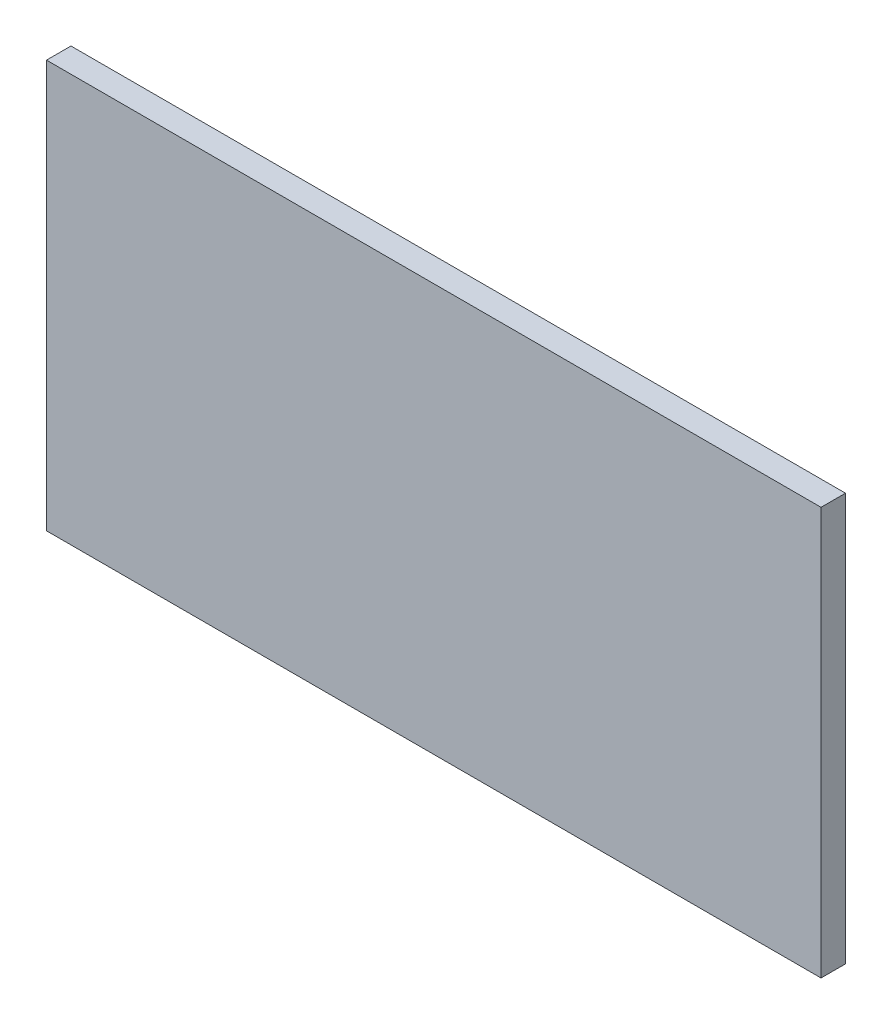
ISO-10303-21;
HEADER;
FILE_DESCRIPTION(('STEP AP214'),'2;1');
FILE_NAME('part.step','',(''),(''),'','','');
FILE_SCHEMA(('AUTOMOTIVE_DESIGN { 1 0 10303 214 1 1 1 1 }'));
ENDSEC;
DATA;
#1=APPLICATION_CONTEXT('core data for automotive mechanical design processes');
#2=APPLICATION_PROTOCOL_DEFINITION('international standard','automotive_design',2000,#1);
#3=PRODUCT_CONTEXT('',#1,'mechanical');
#4=PRODUCT('Part','Part','',(#3));
#5=PRODUCT_RELATED_PRODUCT_CATEGORY('part','',(#4));
#6=PRODUCT_DEFINITION_FORMATION('','',#4);
#7=PRODUCT_DEFINITION_CONTEXT('part definition',#1,'design');
#8=PRODUCT_DEFINITION('design','',#6,#7);
#9=PRODUCT_DEFINITION_SHAPE('','',#8);
#10=(LENGTH_UNIT() NAMED_UNIT(*) SI_UNIT(.MILLI.,.METRE.));
#11=(NAMED_UNIT(*) PLANE_ANGLE_UNIT() SI_UNIT($,.RADIAN.));
#12=(NAMED_UNIT(*) SI_UNIT($,.STERADIAN.) SOLID_ANGLE_UNIT());
#13=UNCERTAINTY_MEASURE_WITH_UNIT(LENGTH_MEASURE(1.E-05),#10,'distance_accuracy_value','');
#14=(GEOMETRIC_REPRESENTATION_CONTEXT(3) GLOBAL_UNCERTAINTY_ASSIGNED_CONTEXT((#13)) GLOBAL_UNIT_ASSIGNED_CONTEXT((#10,
#11,#12)) REPRESENTATION_CONTEXT('',''));
#15=CARTESIAN_POINT('',(0.,0.,0.));
#16=DIRECTION('',(0.,0.,1.));
#17=DIRECTION('',(1.,0.,0.));
#18=AXIS2_PLACEMENT_3D('',#15,#16,#17);
#19=CARTESIAN_POINT('',(0.,0.,12.));
#20=DIRECTION('',(1.,0.,0.));
#21=DIRECTION('',(0.,0.,-1.));
#22=AXIS2_PLACEMENT_3D('',#19,#20,#21);
#23=PLANE('',#22);
#24=DIRECTION('',(0.,-1.,0.));
#25=VECTOR('',#24,1.);
#26=CARTESIAN_POINT('',(0.,0.,0.));
#27=LINE('',#26,#25);
#28=CARTESIAN_POINT('',(0.,200.,0.));
#29=VERTEX_POINT('',#28);
#30=CARTESIAN_POINT('',(0.,0.,0.));
#31=VERTEX_POINT('',#30);
#32=EDGE_CURVE('E93',#29,#31,#27,.T.);
#33=ORIENTED_EDGE('',*,*,#32,.T.);
#34=DIRECTION('',(0.,0.,-1.));
#35=VECTOR('',#34,1.);
#36=CARTESIAN_POINT('',(0.,0.,12.));
#37=LINE('',#36,#35);
#38=CARTESIAN_POINT('',(0.,0.,12.));
#39=VERTEX_POINT('',#38);
#40=EDGE_CURVE('E11',#39,#31,#37,.T.);
#41=ORIENTED_EDGE('',*,*,#40,.F.);
#42=DIRECTION('',(0.,-1.,0.));
#43=VECTOR('',#42,1.);
#44=CARTESIAN_POINT('',(0.,0.,12.));
#45=LINE('',#44,#43);
#46=CARTESIAN_POINT('',(0.,200.,12.));
#47=VERTEX_POINT('',#46);
#48=EDGE_CURVE('E81',#47,#39,#45,.T.);
#49=ORIENTED_EDGE('',*,*,#48,.F.);
#50=DIRECTION('',(0.,0.,-1.));
#51=VECTOR('',#50,1.);
#52=CARTESIAN_POINT('',(0.,200.,12.));
#53=LINE('',#52,#51);
#54=EDGE_CURVE('E89',#47,#29,#53,.T.);
#55=ORIENTED_EDGE('',*,*,#54,.T.);
#56=EDGE_LOOP('',(#33,#41,#49,#55));
#57=FACE_BOUND('',#56,.T.);
#58=ADVANCED_FACE('F30',(#57),#23,.F.);
#59=CARTESIAN_POINT('',(0.,0.,12.));
#60=DIRECTION('',(0.,1.,0.));
#61=DIRECTION('',(0.,0.,1.));
#62=AXIS2_PLACEMENT_3D('',#59,#60,#61);
#63=PLANE('',#62);
#64=DIRECTION('',(1.,0.,0.));
#65=VECTOR('',#64,1.);
#66=CARTESIAN_POINT('',(0.,0.,0.));
#67=LINE('',#66,#65);
#68=CARTESIAN_POINT('',(380.,0.,0.));
#69=VERTEX_POINT('',#68);
#70=EDGE_CURVE('E85',#31,#69,#67,.T.);
#71=ORIENTED_EDGE('',*,*,#70,.T.);
#72=DIRECTION('',(0.,0.,-1.));
#73=VECTOR('',#72,1.);
#74=CARTESIAN_POINT('',(380.,0.,12.));
#75=LINE('',#74,#73);
#76=CARTESIAN_POINT('',(380.,0.,12.));
#77=VERTEX_POINT('',#76);
#78=EDGE_CURVE('E38',#77,#69,#75,.T.);
#79=ORIENTED_EDGE('',*,*,#78,.F.);
#80=DIRECTION('',(1.,0.,0.));
#81=VECTOR('',#80,1.);
#82=CARTESIAN_POINT('',(0.,0.,12.));
#83=LINE('',#82,#81);
#84=EDGE_CURVE('E76',#39,#77,#83,.T.);
#85=ORIENTED_EDGE('',*,*,#84,.F.);
#86=ORIENTED_EDGE('',*,*,#40,.T.);
#87=EDGE_LOOP('',(#71,#79,#85,#86));
#88=FACE_BOUND('',#87,.T.);
#89=ADVANCED_FACE('F84',(#88),#63,.F.);
#90=CARTESIAN_POINT('',(380.,0.,12.));
#91=DIRECTION('',(-1.,0.,0.));
#92=DIRECTION('',(0.,0.,1.));
#93=AXIS2_PLACEMENT_3D('',#90,#91,#92);
#94=PLANE('',#93);
#95=DIRECTION('',(0.,1.,0.));
#96=VECTOR('',#95,1.);
#97=CARTESIAN_POINT('',(380.,0.,0.));
#98=LINE('',#97,#96);
#99=CARTESIAN_POINT('',(380.,200.,0.));
#100=VERTEX_POINT('',#99);
#101=EDGE_CURVE('E63',#69,#100,#98,.T.);
#102=ORIENTED_EDGE('',*,*,#101,.T.);
#103=DIRECTION('',(0.,0.,-1.));
#104=VECTOR('',#103,1.);
#105=CARTESIAN_POINT('',(380.,200.,12.));
#106=LINE('',#105,#104);
#107=CARTESIAN_POINT('',(380.,200.,12.));
#108=VERTEX_POINT('',#107);
#109=EDGE_CURVE('E86',#108,#100,#106,.T.);
#110=ORIENTED_EDGE('',*,*,#109,.F.);
#111=DIRECTION('',(0.,1.,0.));
#112=VECTOR('',#111,1.);
#113=CARTESIAN_POINT('',(380.,0.,12.));
#114=LINE('',#113,#112);
#115=EDGE_CURVE('E79',#77,#108,#114,.T.);
#116=ORIENTED_EDGE('',*,*,#115,.F.);
#117=ORIENTED_EDGE('',*,*,#78,.T.);
#118=EDGE_LOOP('',(#102,#110,#116,#117));
#119=FACE_BOUND('',#118,.T.);
#120=ADVANCED_FACE('F87',(#119),#94,.F.);
#121=CARTESIAN_POINT('',(0.,200.,12.));
#122=DIRECTION('',(0.,-1.,0.));
#123=DIRECTION('',(0.,0.,-1.));
#124=AXIS2_PLACEMENT_3D('',#121,#122,#123);
#125=PLANE('',#124);
#126=DIRECTION('',(-1.,0.,0.));
#127=VECTOR('',#126,1.);
#128=CARTESIAN_POINT('',(0.,200.,0.));
#129=LINE('',#128,#127);
#130=EDGE_CURVE('E69',#100,#29,#129,.T.);
#131=ORIENTED_EDGE('',*,*,#130,.T.);
#132=ORIENTED_EDGE('',*,*,#54,.F.);
#133=DIRECTION('',(-1.,0.,0.));
#134=VECTOR('',#133,1.);
#135=CARTESIAN_POINT('',(0.,200.,12.));
#136=LINE('',#135,#134);
#137=EDGE_CURVE('E46',#108,#47,#136,.T.);
#138=ORIENTED_EDGE('',*,*,#137,.F.);
#139=ORIENTED_EDGE('',*,*,#109,.T.);
#140=EDGE_LOOP('',(#131,#132,#138,#139));
#141=FACE_BOUND('',#140,.T.);
#142=ADVANCED_FACE('F100',(#141),#125,.F.);
#143=CARTESIAN_POINT('',(0.,0.,12.));
#144=DIRECTION('',(0.,0.,-1.));
#145=DIRECTION('',(-1.,0.,0.));
#146=AXIS2_PLACEMENT_3D('',#143,#144,#145);
#147=PLANE('',#146);
#148=ORIENTED_EDGE('',*,*,#48,.T.);
#149=ORIENTED_EDGE('',*,*,#84,.T.);
#150=ORIENTED_EDGE('',*,*,#115,.T.);
#151=ORIENTED_EDGE('',*,*,#137,.T.);
#152=EDGE_LOOP('',(#148,#149,#150,#151));
#153=FACE_BOUND('',#152,.T.);
#154=ADVANCED_FACE('F77',(#153),#147,.F.);
#155=CARTESIAN_POINT('',(0.,0.,0.));
#156=DIRECTION('',(0.,0.,-1.));
#157=DIRECTION('',(-1.,0.,0.));
#158=AXIS2_PLACEMENT_3D('',#155,#156,#157);
#159=PLANE('',#158);
#160=ORIENTED_EDGE('',*,*,#32,.F.);
#161=ORIENTED_EDGE('',*,*,#130,.F.);
#162=ORIENTED_EDGE('',*,*,#101,.F.);
#163=ORIENTED_EDGE('',*,*,#70,.F.);
#164=EDGE_LOOP('',(#160,#161,#162,#163));
#165=FACE_BOUND('',#164,.T.);
#166=ADVANCED_FACE('F103',(#165),#159,.T.);
#167=CLOSED_SHELL('',(#58,#89,#120,#142,#154,#166));
#168=MANIFOLD_SOLID_BREP('B2',#167);
#169=ADVANCED_BREP_SHAPE_REPRESENTATION('',(#18,#168),#14);
#170=SHAPE_DEFINITION_REPRESENTATION(#9,#169);
ENDSEC;
END-ISO-10303-21;
